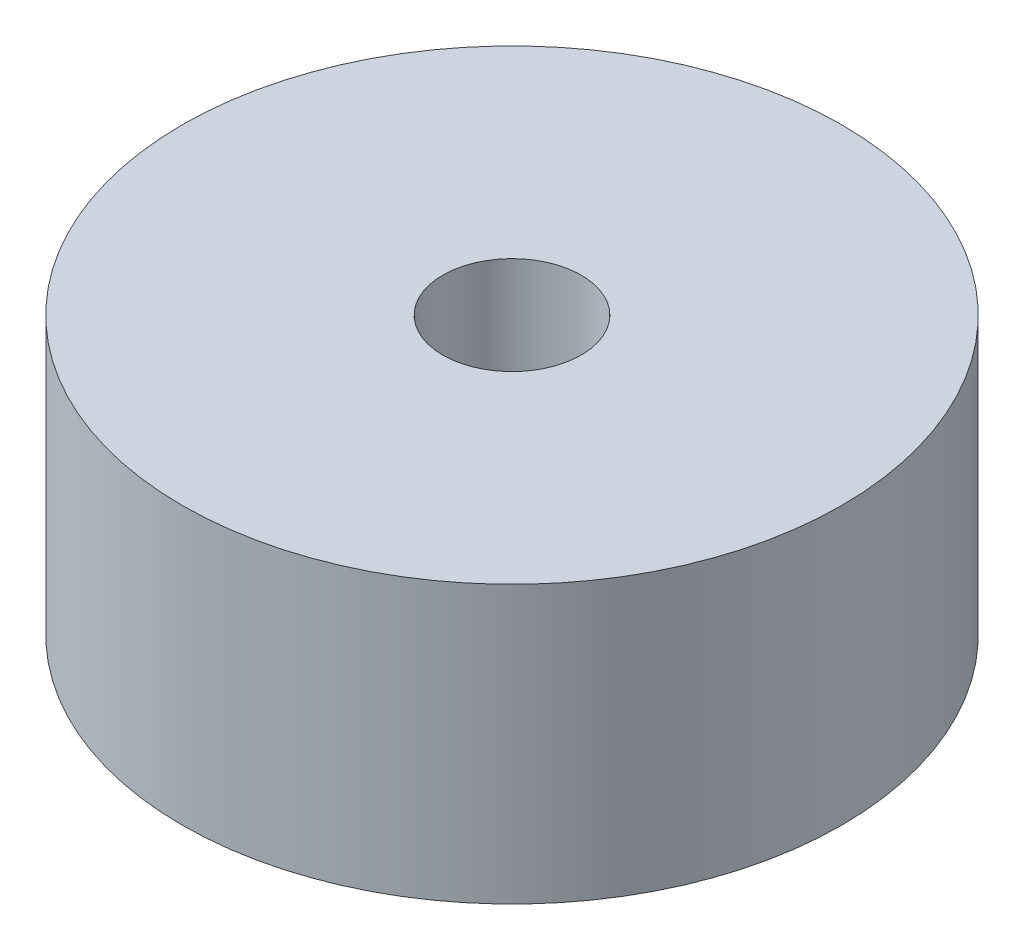
ISO-10303-21;
HEADER;
FILE_DESCRIPTION(('STEP AP214'),'2;1');
FILE_NAME('part.step','',(''),(''),'','','');
FILE_SCHEMA(('AUTOMOTIVE_DESIGN { 1 0 10303 214 1 1 1 1 }'));
ENDSEC;
DATA;
#1=APPLICATION_CONTEXT('core data for automotive mechanical design processes');
#2=APPLICATION_PROTOCOL_DEFINITION('international standard','automotive_design',2000,#1);
#3=PRODUCT_CONTEXT('',#1,'mechanical');
#4=PRODUCT('Part','Part','',(#3));
#5=PRODUCT_RELATED_PRODUCT_CATEGORY('part','',(#4));
#6=PRODUCT_DEFINITION_FORMATION('','',#4);
#7=PRODUCT_DEFINITION_CONTEXT('part definition',#1,'design');
#8=PRODUCT_DEFINITION('design','',#6,#7);
#9=PRODUCT_DEFINITION_SHAPE('','',#8);
#10=(LENGTH_UNIT() NAMED_UNIT(*) SI_UNIT(.MILLI.,.METRE.));
#11=(NAMED_UNIT(*) PLANE_ANGLE_UNIT() SI_UNIT($,.RADIAN.));
#12=(NAMED_UNIT(*) SI_UNIT($,.STERADIAN.) SOLID_ANGLE_UNIT());
#13=UNCERTAINTY_MEASURE_WITH_UNIT(LENGTH_MEASURE(1.E-05),#10,'distance_accuracy_value','');
#14=(GEOMETRIC_REPRESENTATION_CONTEXT(3) GLOBAL_UNCERTAINTY_ASSIGNED_CONTEXT((#13)) GLOBAL_UNIT_ASSIGNED_CONTEXT((#10,
#11,#12)) REPRESENTATION_CONTEXT('',''));
#15=CARTESIAN_POINT('',(0.,0.,0.));
#16=DIRECTION('',(0.,0.,1.));
#17=DIRECTION('',(1.,0.,0.));
#18=AXIS2_PLACEMENT_3D('',#15,#16,#17);
#19=CARTESIAN_POINT('',(0.,8.,0.));
#20=DIRECTION('',(0.,1.,0.));
#21=DIRECTION('',(0.,0.,1.));
#22=AXIS2_PLACEMENT_3D('',#19,#20,#21);
#23=PLANE('',#22);
#24=CARTESIAN_POINT('',(0.,8.,0.));
#25=DIRECTION('',(0.,1.,0.));
#26=DIRECTION('',(0.,0.,1.));
#27=AXIS2_PLACEMENT_3D('',#24,#25,#26);
#28=CIRCLE('',#27,9.525);
#29=CARTESIAN_POINT('',(0.,8.,9.525));
#30=VERTEX_POINT('',#29);
#31=EDGE_CURVE('E10',#30,#30,#28,.T.);
#32=ORIENTED_EDGE('',*,*,#31,.T.);
#33=EDGE_LOOP('',(#32));
#34=FACE_BOUND('',#33,.T.);
#35=CARTESIAN_POINT('',(0.,8.,0.));
#36=DIRECTION('',(0.,1.,0.));
#37=DIRECTION('',(0.,0.,1.));
#38=AXIS2_PLACEMENT_3D('',#35,#36,#37);
#39=CIRCLE('',#38,2.);
#40=CARTESIAN_POINT('',(0.,8.,2.));
#41=VERTEX_POINT('',#40);
#42=EDGE_CURVE('E41',#41,#41,#39,.T.);
#43=ORIENTED_EDGE('',*,*,#42,.F.);
#44=EDGE_LOOP('',(#43));
#45=FACE_BOUND('',#44,.T.);
#46=ADVANCED_FACE('F30',(#34,#45),#23,.T.);
#47=CARTESIAN_POINT('',(0.,0.,0.));
#48=DIRECTION('',(0.,1.,0.));
#49=DIRECTION('',(0.,0.,1.));
#50=AXIS2_PLACEMENT_3D('',#47,#48,#49);
#51=PLANE('',#50);
#52=CARTESIAN_POINT('',(0.,0.,0.));
#53=DIRECTION('',(0.,1.,0.));
#54=DIRECTION('',(0.,0.,1.));
#55=AXIS2_PLACEMENT_3D('',#52,#53,#54);
#56=CIRCLE('',#55,9.525);
#57=CARTESIAN_POINT('',(0.,0.,9.525));
#58=VERTEX_POINT('',#57);
#59=EDGE_CURVE('E34',#58,#58,#56,.T.);
#60=ORIENTED_EDGE('',*,*,#59,.F.);
#61=EDGE_LOOP('',(#60));
#62=FACE_BOUND('',#61,.T.);
#63=CARTESIAN_POINT('',(0.,0.,0.));
#64=DIRECTION('',(0.,1.,0.));
#65=DIRECTION('',(0.,0.,1.));
#66=AXIS2_PLACEMENT_3D('',#63,#64,#65);
#67=CIRCLE('',#66,2.);
#68=CARTESIAN_POINT('',(0.,0.,2.));
#69=VERTEX_POINT('',#68);
#70=EDGE_CURVE('E43',#69,#69,#67,.T.);
#71=ORIENTED_EDGE('',*,*,#70,.T.);
#72=EDGE_LOOP('',(#71));
#73=FACE_BOUND('',#72,.T.);
#74=ADVANCED_FACE('F53',(#62,#73),#51,.F.);
#75=CARTESIAN_POINT('',(0.,8.,0.));
#76=DIRECTION('',(0.,-1.,0.));
#77=DIRECTION('',(0.,0.,-1.));
#78=AXIS2_PLACEMENT_3D('',#75,#76,#77);
#79=CYLINDRICAL_SURFACE('',#78,9.525);
#80=ORIENTED_EDGE('',*,*,#31,.F.);
#81=EDGE_LOOP('',(#80));
#82=FACE_BOUND('',#81,.T.);
#83=ORIENTED_EDGE('',*,*,#59,.T.);
#84=EDGE_LOOP('',(#83));
#85=FACE_BOUND('',#84,.T.);
#86=ADVANCED_FACE('F32',(#82,#85),#79,.T.);
#87=CARTESIAN_POINT('',(0.,8.,0.));
#88=DIRECTION('',(0.,-1.,0.));
#89=DIRECTION('',(0.,0.,-1.));
#90=AXIS2_PLACEMENT_3D('',#87,#88,#89);
#91=CYLINDRICAL_SURFACE('',#90,2.);
#92=ORIENTED_EDGE('',*,*,#42,.T.);
#93=EDGE_LOOP('',(#92));
#94=FACE_BOUND('',#93,.T.);
#95=ORIENTED_EDGE('',*,*,#70,.F.);
#96=EDGE_LOOP('',(#95));
#97=FACE_BOUND('',#96,.T.);
#98=ADVANCED_FACE('F49',(#94,#97),#91,.F.);
#99=CLOSED_SHELL('',(#46,#74,#86,#98));
#100=MANIFOLD_SOLID_BREP('B2',#99);
#101=ADVANCED_BREP_SHAPE_REPRESENTATION('',(#18,#100),#14);
#102=SHAPE_DEFINITION_REPRESENTATION(#9,#101);
ENDSEC;
END-ISO-10303-21;
